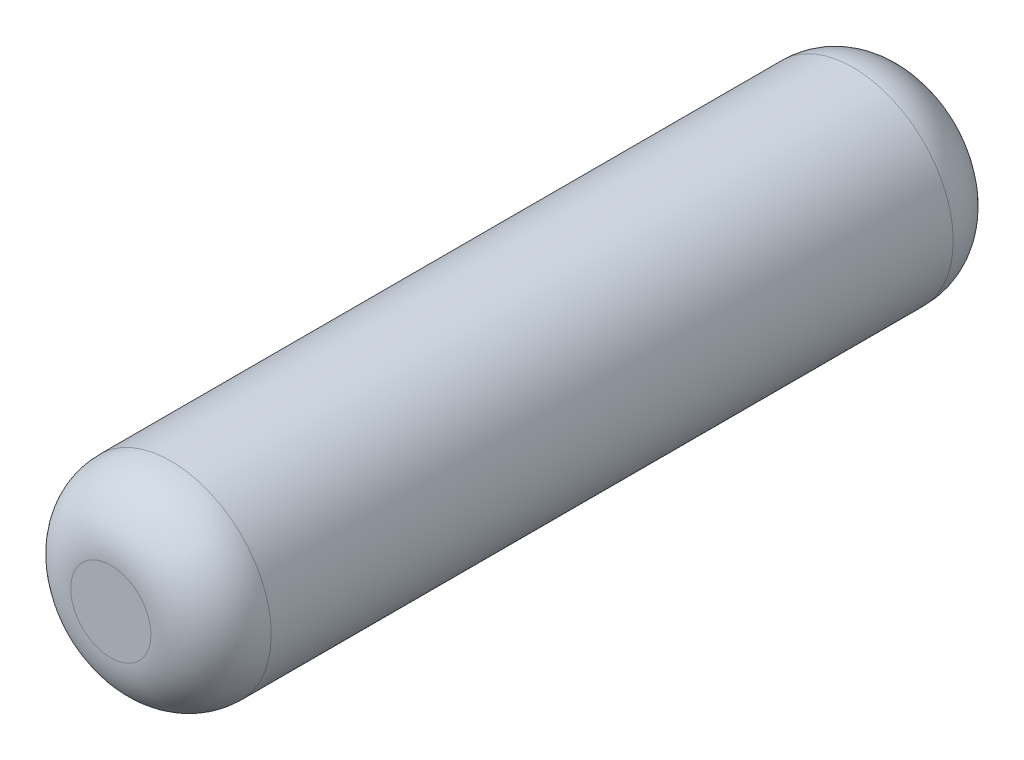
ISO-10303-21;
HEADER;
FILE_DESCRIPTION(('STEP AP214'),'2;1');
FILE_NAME('part.step','',(''),(''),'','','');
FILE_SCHEMA(('AUTOMOTIVE_DESIGN { 1 0 10303 214 1 1 1 1 }'));
ENDSEC;
DATA;
#1=APPLICATION_CONTEXT('core data for automotive mechanical design processes');
#2=APPLICATION_PROTOCOL_DEFINITION('international standard','automotive_design',2000,#1);
#3=PRODUCT_CONTEXT('',#1,'mechanical');
#4=PRODUCT('Part','Part','',(#3));
#5=PRODUCT_RELATED_PRODUCT_CATEGORY('part','',(#4));
#6=PRODUCT_DEFINITION_FORMATION('','',#4);
#7=PRODUCT_DEFINITION_CONTEXT('part definition',#1,'design');
#8=PRODUCT_DEFINITION('design','',#6,#7);
#9=PRODUCT_DEFINITION_SHAPE('','',#8);
#10=(LENGTH_UNIT() NAMED_UNIT(*) SI_UNIT(.MILLI.,.METRE.));
#11=(NAMED_UNIT(*) PLANE_ANGLE_UNIT() SI_UNIT($,.RADIAN.));
#12=(NAMED_UNIT(*) SI_UNIT($,.STERADIAN.) SOLID_ANGLE_UNIT());
#13=UNCERTAINTY_MEASURE_WITH_UNIT(LENGTH_MEASURE(1.E-05),#10,'distance_accuracy_value','');
#14=(GEOMETRIC_REPRESENTATION_CONTEXT(3) GLOBAL_UNCERTAINTY_ASSIGNED_CONTEXT((#13)) GLOBAL_UNIT_ASSIGNED_CONTEXT((#10,
#11,#12)) REPRESENTATION_CONTEXT('',''));
#15=CARTESIAN_POINT('',(0.,0.,0.));
#16=DIRECTION('',(0.,0.,1.));
#17=DIRECTION('',(1.,0.,0.));
#18=AXIS2_PLACEMENT_3D('',#15,#16,#17);
#19=CARTESIAN_POINT('',(0.,0.,40.));
#20=DIRECTION('',(0.,0.,-1.));
#21=DIRECTION('',(-1.,0.,0.));
#22=AXIS2_PLACEMENT_3D('',#19,#20,#21);
#23=CYLINDRICAL_SURFACE('',#22,5.);
#24=CARTESIAN_POINT('',(0.,0.,3.));
#25=DIRECTION('',(0.,0.,1.));
#26=DIRECTION('',(1.,0.,0.));
#27=AXIS2_PLACEMENT_3D('',#24,#25,#26);
#28=CIRCLE('',#27,5.);
#29=CARTESIAN_POINT('',(5.,0.,3.));
#30=VERTEX_POINT('',#29);
#31=EDGE_CURVE('E38',#30,#30,#28,.T.);
#32=ORIENTED_EDGE('',*,*,#31,.T.);
#33=EDGE_LOOP('',(#32));
#34=FACE_BOUND('',#33,.T.);
#35=CARTESIAN_POINT('',(0.,0.,37.));
#36=DIRECTION('',(0.,0.,1.));
#37=DIRECTION('',(1.,0.,0.));
#38=AXIS2_PLACEMENT_3D('',#35,#36,#37);
#39=CIRCLE('',#38,5.);
#40=CARTESIAN_POINT('',(5.,0.,37.));
#41=VERTEX_POINT('',#40);
#42=EDGE_CURVE('E42',#41,#41,#39,.F.);
#43=ORIENTED_EDGE('',*,*,#42,.T.);
#44=EDGE_LOOP('',(#43));
#45=FACE_BOUND('',#44,.T.);
#46=ADVANCED_FACE('F31',(#34,#45),#23,.T.);
#47=CARTESIAN_POINT('',(0.,0.,40.));
#48=DIRECTION('',(0.,0.,1.));
#49=DIRECTION('',(1.,0.,0.));
#50=AXIS2_PLACEMENT_3D('',#47,#48,#49);
#51=PLANE('',#50);
#52=CARTESIAN_POINT('',(0.,0.,40.));
#53=DIRECTION('',(0.,0.,1.));
#54=DIRECTION('',(1.,0.,0.));
#55=AXIS2_PLACEMENT_3D('',#52,#53,#54);
#56=CIRCLE('',#55,2.);
#57=CARTESIAN_POINT('',(2.,0.,40.));
#58=VERTEX_POINT('',#57);
#59=EDGE_CURVE('E46',#58,#58,#56,.T.);
#60=ORIENTED_EDGE('',*,*,#59,.T.);
#61=EDGE_LOOP('',(#60));
#62=FACE_BOUND('',#61,.T.);
#63=ADVANCED_FACE('F52',(#62),#51,.T.);
#64=CARTESIAN_POINT('',(0.,0.,0.));
#65=DIRECTION('',(0.,0.,1.));
#66=DIRECTION('',(1.,0.,0.));
#67=AXIS2_PLACEMENT_3D('',#64,#65,#66);
#68=PLANE('',#67);
#69=CARTESIAN_POINT('',(0.,0.,0.));
#70=DIRECTION('',(0.,0.,1.));
#71=DIRECTION('',(1.,0.,0.));
#72=AXIS2_PLACEMENT_3D('',#69,#70,#71);
#73=CIRCLE('',#72,2.);
#74=CARTESIAN_POINT('',(2.,0.,0.));
#75=VERTEX_POINT('',#74);
#76=EDGE_CURVE('E10',#75,#75,#73,.F.);
#77=ORIENTED_EDGE('',*,*,#76,.T.);
#78=EDGE_LOOP('',(#77));
#79=FACE_BOUND('',#78,.T.);
#80=ADVANCED_FACE('F56',(#79),#68,.F.);
#81=CARTESIAN_POINT('',(0.,0.,37.));
#82=DIRECTION('',(0.,0.,1.));
#83=DIRECTION('',(1.,0.,0.));
#84=AXIS2_PLACEMENT_3D('',#81,#82,#83);
#85=DEGENERATE_TOROIDAL_SURFACE('',#84,2.,3.,.T.);
#86=ORIENTED_EDGE('',*,*,#42,.F.);
#87=EDGE_LOOP('',(#86));
#88=FACE_BOUND('',#87,.T.);
#89=ORIENTED_EDGE('',*,*,#59,.F.);
#90=EDGE_LOOP('',(#89));
#91=FACE_BOUND('',#90,.T.);
#92=ADVANCED_FACE('F54',(#88,#91),#85,.T.);
#93=CARTESIAN_POINT('',(0.,0.,3.));
#94=DIRECTION('',(0.,0.,1.));
#95=DIRECTION('',(1.,0.,0.));
#96=AXIS2_PLACEMENT_3D('',#93,#94,#95);
#97=DEGENERATE_TOROIDAL_SURFACE('',#96,2.,3.,.T.);
#98=ORIENTED_EDGE('',*,*,#76,.F.);
#99=EDGE_LOOP('',(#98));
#100=FACE_BOUND('',#99,.T.);
#101=ORIENTED_EDGE('',*,*,#31,.F.);
#102=EDGE_LOOP('',(#101));
#103=FACE_BOUND('',#102,.T.);
#104=ADVANCED_FACE('F33',(#100,#103),#97,.T.);
#105=CLOSED_SHELL('',(#46,#63,#80,#92,#104));
#106=MANIFOLD_SOLID_BREP('B2',#105);
#107=ADVANCED_BREP_SHAPE_REPRESENTATION('',(#18,#106),#14);
#108=SHAPE_DEFINITION_REPRESENTATION(#9,#107);
ENDSEC;
END-ISO-10303-21;
